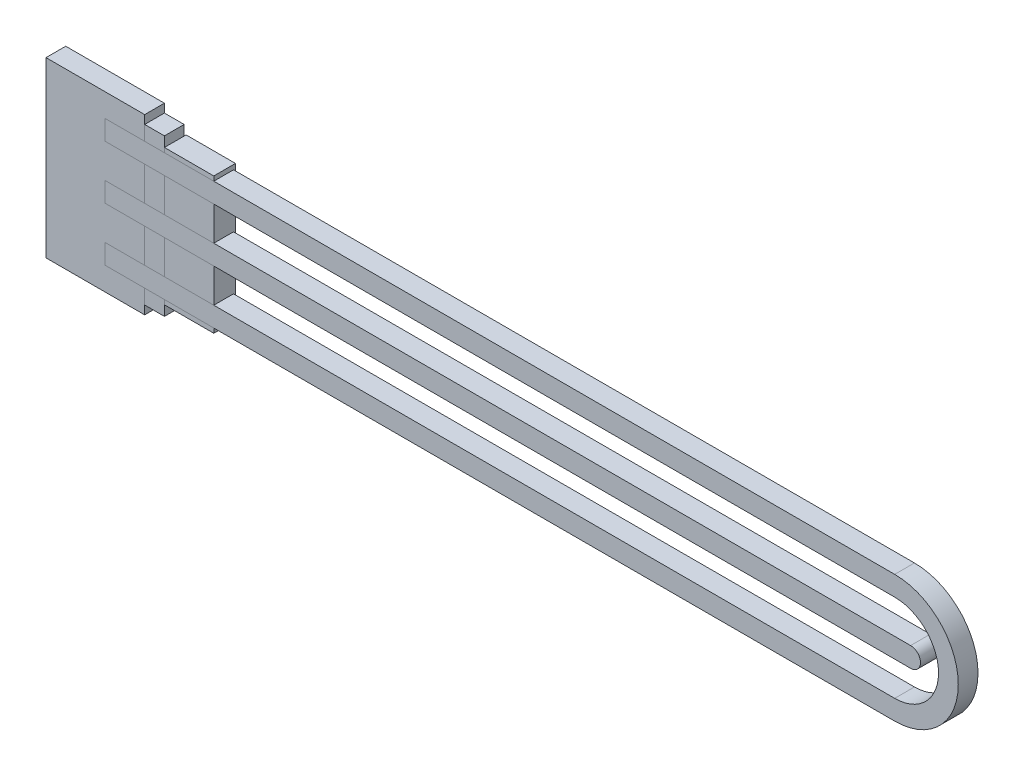
ISO-10303-21;
HEADER;
FILE_DESCRIPTION(('STEP AP214'),'2;1');
FILE_NAME('part.step','',(''),(''),'','','');
FILE_SCHEMA(('AUTOMOTIVE_DESIGN { 1 0 10303 214 1 1 1 1 }'));
ENDSEC;
DATA;
#1=APPLICATION_CONTEXT('core data for automotive mechanical design processes');
#2=APPLICATION_PROTOCOL_DEFINITION('international standard','automotive_design',2000,#1);
#3=PRODUCT_CONTEXT('',#1,'mechanical');
#4=PRODUCT('Part','Part','',(#3));
#5=PRODUCT_RELATED_PRODUCT_CATEGORY('part','',(#4));
#6=PRODUCT_DEFINITION_FORMATION('','',#4);
#7=PRODUCT_DEFINITION_CONTEXT('part definition',#1,'design');
#8=PRODUCT_DEFINITION('design','',#6,#7);
#9=PRODUCT_DEFINITION_SHAPE('','',#8);
#10=(LENGTH_UNIT() NAMED_UNIT(*) SI_UNIT(.MILLI.,.METRE.));
#11=(NAMED_UNIT(*) PLANE_ANGLE_UNIT() SI_UNIT($,.RADIAN.));
#12=(NAMED_UNIT(*) SI_UNIT($,.STERADIAN.) SOLID_ANGLE_UNIT());
#13=UNCERTAINTY_MEASURE_WITH_UNIT(LENGTH_MEASURE(1.E-05),#10,'distance_accuracy_value','');
#14=(GEOMETRIC_REPRESENTATION_CONTEXT(3) GLOBAL_UNCERTAINTY_ASSIGNED_CONTEXT((#13)) GLOBAL_UNIT_ASSIGNED_CONTEXT((#10,
#11,#12)) REPRESENTATION_CONTEXT('',''));
#15=CARTESIAN_POINT('',(0.,0.,0.));
#16=DIRECTION('',(0.,0.,1.));
#17=DIRECTION('',(1.,0.,0.));
#18=AXIS2_PLACEMENT_3D('',#15,#16,#17);
#19=CARTESIAN_POINT('',(0.,0.,0.));
#20=DIRECTION('',(0.,0.,-1.));
#21=DIRECTION('',(-1.,0.,0.));
#22=AXIS2_PLACEMENT_3D('',#19,#20,#21);
#23=PLANE('',#22);
#24=DIRECTION('',(0.,1.,0.));
#25=VECTOR('',#24,1.);
#26=CARTESIAN_POINT('',(20.,11.7376422554555,0.));
#27=LINE('',#26,#25);
#28=CARTESIAN_POINT('',(20.,-76.1473267015327,0.));
#29=VERTEX_POINT('',#28);
#30=CARTESIAN_POINT('',(20.,11.7376422554555,0.));
#31=VERTEX_POINT('',#30);
#32=EDGE_CURVE('E148',#29,#31,#27,.T.);
#33=ORIENTED_EDGE('',*,*,#32,.F.);
#34=DIRECTION('',(1.,0.,0.));
#35=VECTOR('',#34,1.);
#36=CARTESIAN_POINT('',(20.,-76.1473267015327,0.));
#37=LINE('',#36,#35);
#38=CARTESIAN_POINT('',(-30.,-76.1473267015327,0.));
#39=VERTEX_POINT('',#38);
#40=EDGE_CURVE('E159',#39,#29,#37,.T.);
#41=ORIENTED_EDGE('',*,*,#40,.F.);
#42=DIRECTION('',(0.,-1.,0.));
#43=VECTOR('',#42,1.);
#44=CARTESIAN_POINT('',(-30.,11.7376422554555,0.));
#45=LINE('',#44,#43);
#46=CARTESIAN_POINT('',(-30.,11.7376422554555,0.));
#47=VERTEX_POINT('',#46);
#48=EDGE_CURVE('E150',#47,#39,#45,.T.);
#49=ORIENTED_EDGE('',*,*,#48,.F.);
#50=DIRECTION('',(-1.,0.,0.));
#51=VECTOR('',#50,1.);
#52=CARTESIAN_POINT('',(20.,11.7376422554555,0.));
#53=LINE('',#52,#51);
#54=EDGE_CURVE('E140',#31,#47,#53,.T.);
#55=ORIENTED_EDGE('',*,*,#54,.F.);
#56=EDGE_LOOP('',(#33,#41,#49,#55));
#57=FACE_BOUND('',#56,.T.);
#58=ADVANCED_FACE('F98',(#57),#23,.T.);
#59=CARTESIAN_POINT('',(20.,-76.1473267015327,111.112648904926));
#60=DIRECTION('',(0.,1.,0.));
#61=DIRECTION('',(-1.,0.,0.));
#62=AXIS2_PLACEMENT_3D('',#59,#60,#61);
#63=PLANE('',#62);
#64=DIRECTION('',(0.,0.,-1.));
#65=VECTOR('',#64,1.);
#66=CARTESIAN_POINT('',(20.,-76.1473267015327,111.112648904926));
#67=LINE('',#66,#65);
#68=CARTESIAN_POINT('',(20.,-76.1473267015327,9.99999999999999));
#69=VERTEX_POINT('',#68);
#70=EDGE_CURVE('E153',#69,#29,#67,.T.);
#71=ORIENTED_EDGE('',*,*,#70,.F.);
#72=DIRECTION('',(-1.,0.,0.));
#73=VECTOR('',#72,1.);
#74=CARTESIAN_POINT('',(20.,-76.1473267015327,9.99999999999999));
#75=LINE('',#74,#73);
#76=CARTESIAN_POINT('',(-30.,-76.1473267015327,9.99999999999999));
#77=VERTEX_POINT('',#76);
#78=EDGE_CURVE('E102',#69,#77,#75,.T.);
#79=ORIENTED_EDGE('',*,*,#78,.T.);
#80=DIRECTION('',(0.,0.,-1.));
#81=VECTOR('',#80,1.);
#82=CARTESIAN_POINT('',(-30.,-76.1473267015327,111.112648904926));
#83=LINE('',#82,#81);
#84=EDGE_CURVE('E162',#77,#39,#83,.T.);
#85=ORIENTED_EDGE('',*,*,#84,.T.);
#86=ORIENTED_EDGE('',*,*,#40,.T.);
#87=EDGE_LOOP('',(#71,#79,#85,#86));
#88=FACE_BOUND('',#87,.T.);
#89=ADVANCED_FACE('F171',(#88),#63,.F.);
#90=CARTESIAN_POINT('',(-30.,11.7376422554555,111.112648904926));
#91=DIRECTION('',(1.,0.,0.));
#92=DIRECTION('',(0.,0.,-1.));
#93=AXIS2_PLACEMENT_3D('',#90,#91,#92);
#94=PLANE('',#93);
#95=ORIENTED_EDGE('',*,*,#84,.F.);
#96=DIRECTION('',(0.,1.,0.));
#97=VECTOR('',#96,1.);
#98=CARTESIAN_POINT('',(-30.,11.7376422554555,9.99999999999999));
#99=LINE('',#98,#97);
#100=CARTESIAN_POINT('',(-30.,11.7376422554555,9.99999999999999));
#101=VERTEX_POINT('',#100);
#102=EDGE_CURVE('E168',#77,#101,#99,.T.);
#103=ORIENTED_EDGE('',*,*,#102,.T.);
#104=DIRECTION('',(0.,0.,-1.));
#105=VECTOR('',#104,1.);
#106=CARTESIAN_POINT('',(-30.,11.7376422554555,111.112648904926));
#107=LINE('',#106,#105);
#108=EDGE_CURVE('E144',#101,#47,#107,.T.);
#109=ORIENTED_EDGE('',*,*,#108,.T.);
#110=ORIENTED_EDGE('',*,*,#48,.T.);
#111=EDGE_LOOP('',(#95,#103,#109,#110));
#112=FACE_BOUND('',#111,.T.);
#113=ADVANCED_FACE('F167',(#112),#94,.F.);
#114=CARTESIAN_POINT('',(20.,11.7376422554555,111.112648904926));
#115=DIRECTION('',(0.,-1.,0.));
#116=DIRECTION('',(1.,0.,0.));
#117=AXIS2_PLACEMENT_3D('',#114,#115,#116);
#118=PLANE('',#117);
#119=ORIENTED_EDGE('',*,*,#108,.F.);
#120=DIRECTION('',(1.,0.,0.));
#121=VECTOR('',#120,1.);
#122=CARTESIAN_POINT('',(20.,11.7376422554555,9.99999999999999));
#123=LINE('',#122,#121);
#124=CARTESIAN_POINT('',(20.,11.7376422554555,9.99999999999999));
#125=VERTEX_POINT('',#124);
#126=EDGE_CURVE('E107',#101,#125,#123,.T.);
#127=ORIENTED_EDGE('',*,*,#126,.T.);
#128=DIRECTION('',(0.,0.,-1.));
#129=VECTOR('',#128,1.);
#130=CARTESIAN_POINT('',(20.,11.7376422554555,111.112648904926));
#131=LINE('',#130,#129);
#132=EDGE_CURVE('E137',#125,#31,#131,.T.);
#133=ORIENTED_EDGE('',*,*,#132,.T.);
#134=ORIENTED_EDGE('',*,*,#54,.T.);
#135=EDGE_LOOP('',(#119,#127,#133,#134));
#136=FACE_BOUND('',#135,.T.);
#137=ADVANCED_FACE('F139',(#136),#118,.F.);
#138=CARTESIAN_POINT('',(20.,11.7376422554555,111.112648904926));
#139=DIRECTION('',(-1.,0.,0.));
#140=DIRECTION('',(0.,0.,1.));
#141=AXIS2_PLACEMENT_3D('',#138,#139,#140);
#142=PLANE('',#141);
#143=ORIENTED_EDGE('',*,*,#132,.F.);
#144=DIRECTION('',(0.,-1.,0.));
#145=VECTOR('',#144,1.);
#146=CARTESIAN_POINT('',(20.,11.7376422554555,9.99999999999999));
#147=LINE('',#146,#145);
#148=EDGE_CURVE('E13',#125,#69,#147,.T.);
#149=ORIENTED_EDGE('',*,*,#148,.T.);
#150=ORIENTED_EDGE('',*,*,#70,.T.);
#151=ORIENTED_EDGE('',*,*,#32,.T.);
#152=EDGE_LOOP('',(#143,#149,#150,#151));
#153=FACE_BOUND('',#152,.T.);
#154=ADVANCED_FACE('F100',(#153),#142,.F.);
#155=CARTESIAN_POINT('',(408.064158914082,-32.2048422230385,10.));
#156=DIRECTION('',(0.,0.,-1.));
#157=DIRECTION('',(-1.,0.,0.));
#158=AXIS2_PLACEMENT_3D('',#155,#156,#157);
#159=PLANE('',#158);
#160=ORIENTED_EDGE('',*,*,#126,.F.);
#161=ORIENTED_EDGE('',*,*,#102,.F.);
#162=ORIENTED_EDGE('',*,*,#78,.F.);
#163=ORIENTED_EDGE('',*,*,#148,.F.);
#164=EDGE_LOOP('',(#160,#161,#162,#163));
#165=FACE_BOUND('',#164,.T.);
#166=ADVANCED_FACE('F185',(#165),#159,.F.);
#167=CLOSED_SHELL('',(#58,#89,#113,#137,#154,#166));
#168=MANIFOLD_SOLID_BREP('B2',#167);
#169=CARTESIAN_POINT('',(0.,0.,0.));
#170=DIRECTION('',(0.,0.,1.));
#171=DIRECTION('',(1.,0.,0.));
#172=AXIS2_PLACEMENT_3D('',#169,#170,#171);
#173=PLANE('',#172);
#174=DIRECTION('',(0.,-1.,0.));
#175=VECTOR('',#174,1.);
#176=CARTESIAN_POINT('',(20.,0.,0.));
#177=LINE('',#176,#175);
#178=CARTESIAN_POINT('',(20.,7.40969782005409,0.));
#179=VERTEX_POINT('',#178);
#180=CARTESIAN_POINT('',(20.,-71.8193822661313,0.));
#181=VERTEX_POINT('',#180);
#182=EDGE_CURVE('E292',#179,#181,#177,.T.);
#183=ORIENTED_EDGE('',*,*,#182,.F.);
#184=DIRECTION('',(-1.,0.,0.));
#185=VECTOR('',#184,1.);
#186=CARTESIAN_POINT('',(0.,7.40969782005409,0.));
#187=LINE('',#186,#185);
#188=CARTESIAN_POINT('',(30.,7.40969782005409,0.));
#189=VERTEX_POINT('',#188);
#190=EDGE_CURVE('E302',#189,#179,#187,.T.);
#191=ORIENTED_EDGE('',*,*,#190,.F.);
#192=DIRECTION('',(0.,-1.,0.));
#193=VECTOR('',#192,1.);
#194=CARTESIAN_POINT('',(30.,0.,0.));
#195=LINE('',#194,#193);
#196=CARTESIAN_POINT('',(30.,-71.8193822661313,0.));
#197=VERTEX_POINT('',#196);
#198=EDGE_CURVE('E300',#189,#197,#195,.T.);
#199=ORIENTED_EDGE('',*,*,#198,.T.);
#200=DIRECTION('',(-1.,0.,0.));
#201=VECTOR('',#200,1.);
#202=CARTESIAN_POINT('',(0.,-71.8193822661313,0.));
#203=LINE('',#202,#201);
#204=EDGE_CURVE('E287',#197,#181,#203,.T.);
#205=ORIENTED_EDGE('',*,*,#204,.T.);
#206=EDGE_LOOP('',(#183,#191,#199,#205));
#207=FACE_BOUND('',#206,.T.);
#208=ADVANCED_FACE('F244',(#207),#173,.F.);
#209=CARTESIAN_POINT('',(0.,7.40969782005409,89.857667955577));
#210=DIRECTION('',(0.,-1.,0.));
#211=DIRECTION('',(0.,0.,-1.));
#212=AXIS2_PLACEMENT_3D('',#209,#210,#211);
#213=PLANE('',#212);
#214=DIRECTION('',(0.,0.,-1.));
#215=VECTOR('',#214,1.);
#216=CARTESIAN_POINT('',(20.,7.40969782005409,89.857667955577));
#217=LINE('',#216,#215);
#218=CARTESIAN_POINT('',(20.,7.40969782005409,9.99999999999999));
#219=VERTEX_POINT('',#218);
#220=EDGE_CURVE('E294',#219,#179,#217,.T.);
#221=ORIENTED_EDGE('',*,*,#220,.F.);
#222=DIRECTION('',(1.,0.,0.));
#223=VECTOR('',#222,1.);
#224=CARTESIAN_POINT('',(0.,7.40969782005409,9.99999999999999));
#225=LINE('',#224,#223);
#226=CARTESIAN_POINT('',(30.,7.40969782005409,9.99999999999999));
#227=VERTEX_POINT('',#226);
#228=EDGE_CURVE('E248',#219,#227,#225,.T.);
#229=ORIENTED_EDGE('',*,*,#228,.T.);
#230=DIRECTION('',(0.,0.,-1.));
#231=VECTOR('',#230,1.);
#232=CARTESIAN_POINT('',(30.,7.40969782005409,89.857667955577));
#233=LINE('',#232,#231);
#234=EDGE_CURVE('E307',#227,#189,#233,.T.);
#235=ORIENTED_EDGE('',*,*,#234,.T.);
#236=ORIENTED_EDGE('',*,*,#190,.T.);
#237=EDGE_LOOP('',(#221,#229,#235,#236));
#238=FACE_BOUND('',#237,.T.);
#239=ADVANCED_FACE('F317',(#238),#213,.F.);
#240=CARTESIAN_POINT('',(30.,0.,89.857667955577));
#241=DIRECTION('',(1.,0.,0.));
#242=DIRECTION('',(0.,0.,-1.));
#243=AXIS2_PLACEMENT_3D('',#240,#241,#242);
#244=PLANE('',#243);
#245=DIRECTION('',(0.,1.,0.));
#246=VECTOR('',#245,1.);
#247=CARTESIAN_POINT('',(30.,0.,9.99999999999999));
#248=LINE('',#247,#246);
#249=CARTESIAN_POINT('',(30.,-71.8193822661313,9.99999999999999));
#250=VERTEX_POINT('',#249);
#251=EDGE_CURVE('E313',#250,#227,#248,.T.);
#252=ORIENTED_EDGE('',*,*,#251,.F.);
#253=DIRECTION('',(0.,0.,-1.));
#254=VECTOR('',#253,1.);
#255=CARTESIAN_POINT('',(30.,-71.8193822661313,89.857667955577));
#256=LINE('',#255,#254);
#257=EDGE_CURVE('E290',#250,#197,#256,.T.);
#258=ORIENTED_EDGE('',*,*,#257,.T.);
#259=ORIENTED_EDGE('',*,*,#198,.F.);
#260=ORIENTED_EDGE('',*,*,#234,.F.);
#261=EDGE_LOOP('',(#252,#258,#259,#260));
#262=FACE_BOUND('',#261,.T.);
#263=ADVANCED_FACE('F311',(#262),#244,.T.);
#264=CARTESIAN_POINT('',(0.,-71.8193822661313,89.857667955577));
#265=DIRECTION('',(0.,-1.,0.));
#266=DIRECTION('',(0.,0.,-1.));
#267=AXIS2_PLACEMENT_3D('',#264,#265,#266);
#268=PLANE('',#267);
#269=DIRECTION('',(1.,0.,0.));
#270=VECTOR('',#269,1.);
#271=CARTESIAN_POINT('',(0.,-71.8193822661313,9.99999999999999));
#272=LINE('',#271,#270);
#273=CARTESIAN_POINT('',(20.,-71.8193822661313,9.99999999999999));
#274=VERTEX_POINT('',#273);
#275=EDGE_CURVE('E253',#274,#250,#272,.T.);
#276=ORIENTED_EDGE('',*,*,#275,.F.);
#277=DIRECTION('',(0.,0.,-1.));
#278=VECTOR('',#277,1.);
#279=CARTESIAN_POINT('',(20.,-71.8193822661313,89.857667955577));
#280=LINE('',#279,#278);
#281=EDGE_CURVE('E283',#274,#181,#280,.T.);
#282=ORIENTED_EDGE('',*,*,#281,.T.);
#283=ORIENTED_EDGE('',*,*,#204,.F.);
#284=ORIENTED_EDGE('',*,*,#257,.F.);
#285=EDGE_LOOP('',(#276,#282,#283,#284));
#286=FACE_BOUND('',#285,.T.);
#287=ADVANCED_FACE('F285',(#286),#268,.T.);
#288=CARTESIAN_POINT('',(20.,0.,89.857667955577));
#289=DIRECTION('',(1.,0.,0.));
#290=DIRECTION('',(0.,0.,-1.));
#291=AXIS2_PLACEMENT_3D('',#288,#289,#290);
#292=PLANE('',#291);
#293=ORIENTED_EDGE('',*,*,#281,.F.);
#294=DIRECTION('',(0.,1.,0.));
#295=VECTOR('',#294,1.);
#296=CARTESIAN_POINT('',(20.,0.,9.99999999999999));
#297=LINE('',#296,#295);
#298=EDGE_CURVE('E96',#274,#219,#297,.T.);
#299=ORIENTED_EDGE('',*,*,#298,.T.);
#300=ORIENTED_EDGE('',*,*,#220,.T.);
#301=ORIENTED_EDGE('',*,*,#182,.T.);
#302=EDGE_LOOP('',(#293,#299,#300,#301));
#303=FACE_BOUND('',#302,.T.);
#304=ADVANCED_FACE('F246',(#303),#292,.F.);
#305=CARTESIAN_POINT('',(408.064158914082,-32.2048422230385,10.));
#306=DIRECTION('',(0.,0.,-1.));
#307=DIRECTION('',(-1.,0.,0.));
#308=AXIS2_PLACEMENT_3D('',#305,#306,#307);
#309=PLANE('',#308);
#310=ORIENTED_EDGE('',*,*,#275,.T.);
#311=ORIENTED_EDGE('',*,*,#251,.T.);
#312=ORIENTED_EDGE('',*,*,#228,.F.);
#313=ORIENTED_EDGE('',*,*,#298,.F.);
#314=EDGE_LOOP('',(#310,#311,#312,#313));
#315=FACE_BOUND('',#314,.T.);
#316=ADVANCED_FACE('F331',(#315),#309,.F.);
#317=CLOSED_SHELL('',(#208,#239,#263,#287,#304,#316));
#318=MANIFOLD_SOLID_BREP('B7',#317);
#319=CARTESIAN_POINT('',(30.,0.,-0.999999999999957));
#320=DIRECTION('',(-1.,0.,0.));
#321=DIRECTION('',(0.,0.,1.));
#322=AXIS2_PLACEMENT_3D('',#319,#320,#321);
#323=PLANE('',#322);
#324=DIRECTION('',(0.,0.,1.));
#325=VECTOR('',#324,1.);
#326=CARTESIAN_POINT('',(30.,-66.7222777292492,-0.999999999999957));
#327=LINE('',#326,#325);
#328=CARTESIAN_POINT('',(30.,-66.7222777292492,-0.999999999999957));
#329=VERTEX_POINT('',#328);
#330=CARTESIAN_POINT('',(30.,-66.7222777292492,9.99999999999999));
#331=VERTEX_POINT('',#330);
#332=EDGE_CURVE('E394',#329,#331,#327,.T.);
#333=ORIENTED_EDGE('',*,*,#332,.T.);
#334=DIRECTION('',(0.,1.,0.));
#335=VECTOR('',#334,1.);
#336=CARTESIAN_POINT('',(30.,0.,9.99999999999999));
#337=LINE('',#336,#335);
#338=CARTESIAN_POINT('',(30.,2.31259328317195,9.99999999999999));
#339=VERTEX_POINT('',#338);
#340=EDGE_CURVE('E452',#331,#339,#337,.T.);
#341=ORIENTED_EDGE('',*,*,#340,.T.);
#342=DIRECTION('',(0.,0.,1.));
#343=VECTOR('',#342,1.);
#344=CARTESIAN_POINT('',(30.,2.31259328317195,-0.999999999999957));
#345=LINE('',#344,#343);
#346=CARTESIAN_POINT('',(30.,2.31259328317195,-0.999999999999957));
#347=VERTEX_POINT('',#346);
#348=EDGE_CURVE('E242',#347,#339,#345,.T.);
#349=ORIENTED_EDGE('',*,*,#348,.F.);
#350=DIRECTION('',(0.,-1.,0.));
#351=VECTOR('',#350,1.);
#352=CARTESIAN_POINT('',(30.,0.,-0.999999999999957));
#353=LINE('',#352,#351);
#354=EDGE_CURVE('E451',#347,#329,#353,.T.);
#355=ORIENTED_EDGE('',*,*,#354,.T.);
#356=EDGE_LOOP('',(#333,#341,#349,#355));
#357=FACE_BOUND('',#356,.T.);
#358=ADVANCED_FACE('F391',(#357),#323,.T.);
#359=CARTESIAN_POINT('',(0.,2.31259328317195,-0.999999999999957));
#360=DIRECTION('',(0.,-1.,0.));
#361=DIRECTION('',(1.,0.,0.));
#362=AXIS2_PLACEMENT_3D('',#359,#360,#361);
#363=PLANE('',#362);
#364=ORIENTED_EDGE('',*,*,#348,.T.);
#365=DIRECTION('',(-1.,0.,0.));
#366=VECTOR('',#365,1.);
#367=CARTESIAN_POINT('',(0.,2.31259328317195,9.99999999999999));
#368=LINE('',#367,#366);
#369=CARTESIAN_POINT('',(55.,2.31259328317195,9.99999999999999));
#370=VERTEX_POINT('',#369);
#371=EDGE_CURVE('E446',#370,#339,#368,.T.);
#372=ORIENTED_EDGE('',*,*,#371,.F.);
#373=DIRECTION('',(0.,0.,1.));
#374=VECTOR('',#373,1.);
#375=CARTESIAN_POINT('',(55.,2.31259328317195,-0.999999999999957));
#376=LINE('',#375,#374);
#377=CARTESIAN_POINT('',(55.,2.31259328317195,-0.999999999999957));
#378=VERTEX_POINT('',#377);
#379=EDGE_CURVE('E399',#378,#370,#376,.T.);
#380=ORIENTED_EDGE('',*,*,#379,.F.);
#381=DIRECTION('',(1.,0.,0.));
#382=VECTOR('',#381,1.);
#383=CARTESIAN_POINT('',(0.,2.31259328317195,-0.999999999999957));
#384=LINE('',#383,#382);
#385=EDGE_CURVE('E412',#347,#378,#384,.T.);
#386=ORIENTED_EDGE('',*,*,#385,.F.);
#387=EDGE_LOOP('',(#364,#372,#380,#386));
#388=FACE_BOUND('',#387,.T.);
#389=ADVANCED_FACE('F450',(#388),#363,.F.);
#390=CARTESIAN_POINT('',(55.,0.,-0.999999999999957));
#391=DIRECTION('',(-1.,0.,0.));
#392=DIRECTION('',(0.,0.,1.));
#393=AXIS2_PLACEMENT_3D('',#390,#391,#392);
#394=PLANE('',#393);
#395=ORIENTED_EDGE('',*,*,#379,.T.);
#396=DIRECTION('',(0.,1.,0.));
#397=VECTOR('',#396,1.);
#398=CARTESIAN_POINT('',(55.,0.,9.99999999999999));
#399=LINE('',#398,#397);
#400=CARTESIAN_POINT('',(55.,-66.7222777292492,9.99999999999999));
#401=VERTEX_POINT('',#400);
#402=EDGE_CURVE('E435',#401,#370,#399,.T.);
#403=ORIENTED_EDGE('',*,*,#402,.F.);
#404=DIRECTION('',(0.,0.,1.));
#405=VECTOR('',#404,1.);
#406=CARTESIAN_POINT('',(55.,-66.7222777292492,-0.999999999999957));
#407=LINE('',#406,#405);
#408=CARTESIAN_POINT('',(55.,-66.7222777292492,-0.999999999999957));
#409=VERTEX_POINT('',#408);
#410=EDGE_CURVE('E439',#409,#401,#407,.T.);
#411=ORIENTED_EDGE('',*,*,#410,.F.);
#412=DIRECTION('',(0.,-1.,0.));
#413=VECTOR('',#412,1.);
#414=CARTESIAN_POINT('',(55.,0.,-0.999999999999957));
#415=LINE('',#414,#413);
#416=EDGE_CURVE('E436',#378,#409,#415,.T.);
#417=ORIENTED_EDGE('',*,*,#416,.F.);
#418=EDGE_LOOP('',(#395,#403,#411,#417));
#419=FACE_BOUND('',#418,.T.);
#420=ADVANCED_FACE('F433',(#419),#394,.F.);
#421=CARTESIAN_POINT('',(0.,-66.7222777292492,-0.999999999999957));
#422=DIRECTION('',(0.,-1.,0.));
#423=DIRECTION('',(1.,0.,0.));
#424=AXIS2_PLACEMENT_3D('',#421,#422,#423);
#425=PLANE('',#424);
#426=ORIENTED_EDGE('',*,*,#410,.T.);
#427=DIRECTION('',(-1.,0.,0.));
#428=VECTOR('',#427,1.);
#429=CARTESIAN_POINT('',(0.,-66.7222777292492,9.99999999999999));
#430=LINE('',#429,#428);
#431=EDGE_CURVE('E448',#401,#331,#430,.T.);
#432=ORIENTED_EDGE('',*,*,#431,.T.);
#433=ORIENTED_EDGE('',*,*,#332,.F.);
#434=DIRECTION('',(1.,0.,0.));
#435=VECTOR('',#434,1.);
#436=CARTESIAN_POINT('',(0.,-66.7222777292492,-0.999999999999957));
#437=LINE('',#436,#435);
#438=EDGE_CURVE('E454',#329,#409,#437,.T.);
#439=ORIENTED_EDGE('',*,*,#438,.T.);
#440=EDGE_LOOP('',(#426,#432,#433,#439));
#441=FACE_BOUND('',#440,.T.);
#442=ADVANCED_FACE('F464',(#441),#425,.T.);
#443=CARTESIAN_POINT('',(0.,0.,-0.999999999999957));
#444=DIRECTION('',(0.,0.,1.));
#445=DIRECTION('',(1.,0.,0.));
#446=AXIS2_PLACEMENT_3D('',#443,#444,#445);
#447=PLANE('',#446);
#448=ORIENTED_EDGE('',*,*,#354,.F.);
#449=ORIENTED_EDGE('',*,*,#385,.T.);
#450=ORIENTED_EDGE('',*,*,#416,.T.);
#451=ORIENTED_EDGE('',*,*,#438,.F.);
#452=EDGE_LOOP('',(#448,#449,#450,#451));
#453=FACE_BOUND('',#452,.T.);
#454=ADVANCED_FACE('F466',(#453),#447,.F.);
#455=CARTESIAN_POINT('',(408.064158914082,-32.2048422230385,10.));
#456=DIRECTION('',(0.,0.,-1.));
#457=DIRECTION('',(-1.,0.,0.));
#458=AXIS2_PLACEMENT_3D('',#455,#456,#457);
#459=PLANE('',#458);
#460=ORIENTED_EDGE('',*,*,#431,.F.);
#461=ORIENTED_EDGE('',*,*,#402,.T.);
#462=ORIENTED_EDGE('',*,*,#371,.T.);
#463=ORIENTED_EDGE('',*,*,#340,.F.);
#464=EDGE_LOOP('',(#460,#461,#462,#463));
#465=FACE_BOUND('',#464,.T.);
#466=ADVANCED_FACE('F444',(#465),#459,.F.);
#467=CLOSED_SHELL('',(#358,#389,#420,#442,#454,#466));
#468=MANIFOLD_SOLID_BREP('B90',#467);
#469=CARTESIAN_POINT('',(-15.,-59.4096844460773,5.));
#470=DIRECTION('',(1.,0.,0.));
#471=DIRECTION('',(0.,0.,-1.));
#472=AXIS2_PLACEMENT_3D('',#469,#470,#471);
#473=CYLINDRICAL_SURFACE('',#472,3.);
#474=CARTESIAN_POINT('',(-15.,-59.4096844460773,5.));
#475=DIRECTION('',(-1.,0.,0.));
#476=DIRECTION('',(0.,0.,1.));
#477=AXIS2_PLACEMENT_3D('',#474,#475,#476);
#478=CIRCLE('',#477,3.);
#479=CARTESIAN_POINT('',(-15.,-59.4096844460773,8.));
#480=VERTEX_POINT('',#479);
#481=EDGE_CURVE('E390',#480,#480,#478,.T.);
#482=ORIENTED_EDGE('',*,*,#481,.F.);
#483=EDGE_LOOP('',(#482));
#484=FACE_BOUND('',#483,.T.);
#485=CARTESIAN_POINT('',(0.,-59.4096844460773,5.));
#486=DIRECTION('',(-1.,0.,0.));
#487=DIRECTION('',(0.,0.,1.));
#488=AXIS2_PLACEMENT_3D('',#485,#486,#487);
#489=CIRCLE('',#488,3.);
#490=CARTESIAN_POINT('',(0.,-59.4096844460773,8.));
#491=VERTEX_POINT('',#490);
#492=EDGE_CURVE('E547',#491,#491,#489,.T.);
#493=ORIENTED_EDGE('',*,*,#492,.T.);
#494=EDGE_LOOP('',(#493));
#495=FACE_BOUND('',#494,.T.);
#496=ADVANCED_FACE('F544',(#484,#495),#473,.T.);
#497=CARTESIAN_POINT('',(-15.,-59.4096844460773,5.));
#498=DIRECTION('',(-1.,0.,0.));
#499=DIRECTION('',(0.,0.,1.));
#500=AXIS2_PLACEMENT_3D('',#497,#498,#499);
#501=PLANE('',#500);
#502=ORIENTED_EDGE('',*,*,#481,.T.);
#503=EDGE_LOOP('',(#502));
#504=FACE_BOUND('',#503,.T.);
#505=ADVANCED_FACE('F559',(#504),#501,.T.);
#506=CARTESIAN_POINT('',(0.,-59.4096844460773,5.));
#507=DIRECTION('',(-1.,0.,0.));
#508=DIRECTION('',(0.,0.,1.));
#509=AXIS2_PLACEMENT_3D('',#506,#507,#508);
#510=PLANE('',#509);
#511=ORIENTED_EDGE('',*,*,#492,.F.);
#512=EDGE_LOOP('',(#511));
#513=FACE_BOUND('',#512,.T.);
#514=ADVANCED_FACE('F557',(#513),#510,.F.);
#515=CLOSED_SHELL('',(#496,#505,#514));
#516=MANIFOLD_SOLID_BREP('B236',#515);
#517=CARTESIAN_POINT('',(-15.,-4.90697990871341,5.));
#518=DIRECTION('',(1.,0.,0.));
#519=DIRECTION('',(0.,0.,-1.));
#520=AXIS2_PLACEMENT_3D('',#517,#518,#519);
#521=CYLINDRICAL_SURFACE('',#520,3.);
#522=CARTESIAN_POINT('',(-15.,-4.90697990871341,5.));
#523=DIRECTION('',(-1.,0.,0.));
#524=DIRECTION('',(0.,0.,1.));
#525=AXIS2_PLACEMENT_3D('',#522,#523,#524);
#526=CIRCLE('',#525,3.);
#527=CARTESIAN_POINT('',(-15.,-4.90697990871341,8.));
#528=VERTEX_POINT('',#527);
#529=EDGE_CURVE('E543',#528,#528,#526,.T.);
#530=ORIENTED_EDGE('',*,*,#529,.F.);
#531=EDGE_LOOP('',(#530));
#532=FACE_BOUND('',#531,.T.);
#533=CARTESIAN_POINT('',(0.,-4.90697990871341,5.));
#534=DIRECTION('',(-1.,0.,0.));
#535=DIRECTION('',(0.,0.,1.));
#536=AXIS2_PLACEMENT_3D('',#533,#534,#535);
#537=CIRCLE('',#536,3.);
#538=CARTESIAN_POINT('',(0.,-4.90697990871341,8.));
#539=VERTEX_POINT('',#538);
#540=EDGE_CURVE('E604',#539,#539,#537,.T.);
#541=ORIENTED_EDGE('',*,*,#540,.T.);
#542=EDGE_LOOP('',(#541));
#543=FACE_BOUND('',#542,.T.);
#544=ADVANCED_FACE('F601',(#532,#543),#521,.T.);
#545=CARTESIAN_POINT('',(-15.,-4.90697990871341,5.));
#546=DIRECTION('',(-1.,0.,0.));
#547=DIRECTION('',(0.,0.,1.));
#548=AXIS2_PLACEMENT_3D('',#545,#546,#547);
#549=PLANE('',#548);
#550=ORIENTED_EDGE('',*,*,#529,.T.);
#551=EDGE_LOOP('',(#550));
#552=FACE_BOUND('',#551,.T.);
#553=ADVANCED_FACE('F616',(#552),#549,.T.);
#554=CARTESIAN_POINT('',(0.,-4.90697990871341,5.));
#555=DIRECTION('',(-1.,0.,0.));
#556=DIRECTION('',(0.,0.,1.));
#557=AXIS2_PLACEMENT_3D('',#554,#555,#556);
#558=PLANE('',#557);
#559=ORIENTED_EDGE('',*,*,#540,.F.);
#560=EDGE_LOOP('',(#559));
#561=FACE_BOUND('',#560,.T.);
#562=ADVANCED_FACE('F614',(#561),#558,.F.);
#563=CLOSED_SHELL('',(#544,#553,#562));
#564=MANIFOLD_SOLID_BREP('B385',#563);
#565=CARTESIAN_POINT('',(0.,-27.2048422230386,10.));
#566=DIRECTION('',(1.,0.,0.));
#567=DIRECTION('',(0.,1.,0.));
#568=AXIS2_PLACEMENT_3D('',#565,#566,#567);
#569=PLANE('',#568);
#570=DIRECTION('',(0.,-1.,0.));
#571=VECTOR('',#570,1.);
#572=CARTESIAN_POINT('',(0.,-27.2048422230386,0.));
#573=LINE('',#572,#571);
#574=CARTESIAN_POINT('',(0.,-27.2048422230386,0.));
#575=VERTEX_POINT('',#574);
#576=CARTESIAN_POINT('',(0.,-37.2048422230386,0.));
#577=VERTEX_POINT('',#576);
#578=EDGE_CURVE('E599',#575,#577,#573,.T.);
#579=ORIENTED_EDGE('',*,*,#578,.T.);
#580=DIRECTION('',(0.,0.,-1.));
#581=VECTOR('',#580,1.);
#582=CARTESIAN_POINT('',(0.,-37.2048422230386,10.));
#583=LINE('',#582,#581);
#584=CARTESIAN_POINT('',(0.,-37.2048422230386,10.));
#585=VERTEX_POINT('',#584);
#586=EDGE_CURVE('E728',#585,#577,#583,.T.);
#587=ORIENTED_EDGE('',*,*,#586,.F.);
#588=DIRECTION('',(0.,-1.,0.));
#589=VECTOR('',#588,1.);
#590=CARTESIAN_POINT('',(0.,-27.2048422230386,10.));
#591=LINE('',#590,#589);
#592=CARTESIAN_POINT('',(0.,-27.2048422230386,10.));
#593=VERTEX_POINT('',#592);
#594=EDGE_CURVE('E661',#593,#585,#591,.T.);
#595=ORIENTED_EDGE('',*,*,#594,.F.);
#596=DIRECTION('',(0.,0.,-1.));
#597=VECTOR('',#596,1.);
#598=CARTESIAN_POINT('',(0.,-27.2048422230386,10.));
#599=LINE('',#598,#597);
#600=EDGE_CURVE('E716',#593,#575,#599,.T.);
#601=ORIENTED_EDGE('',*,*,#600,.T.);
#602=EDGE_LOOP('',(#579,#587,#595,#601));
#603=FACE_BOUND('',#602,.T.);
#604=ADVANCED_FACE('F657',(#603),#569,.F.);
#605=CARTESIAN_POINT('',(0.,-37.2048422230386,10.));
#606=DIRECTION('',(0.,1.,0.));
#607=DIRECTION('',(-1.,0.,0.));
#608=AXIS2_PLACEMENT_3D('',#605,#606,#607);
#609=PLANE('',#608);
#610=DIRECTION('',(1.,0.,0.));
#611=VECTOR('',#610,1.);
#612=CARTESIAN_POINT('',(0.,-37.2048422230386,0.));
#613=LINE('',#612,#611);
#614=CARTESIAN_POINT('',(408.064158914082,-37.2048422230385,0.));
#615=VERTEX_POINT('',#614);
#616=EDGE_CURVE('E667',#577,#615,#613,.T.);
#617=ORIENTED_EDGE('',*,*,#616,.T.);
#618=DIRECTION('',(0.,0.,-1.));
#619=VECTOR('',#618,1.);
#620=CARTESIAN_POINT('',(408.064158914082,-37.2048422230385,10.));
#621=LINE('',#620,#619);
#622=CARTESIAN_POINT('',(408.064158914082,-37.2048422230385,10.));
#623=VERTEX_POINT('',#622);
#624=EDGE_CURVE('E712',#623,#615,#621,.T.);
#625=ORIENTED_EDGE('',*,*,#624,.F.);
#626=DIRECTION('',(1.,0.,0.));
#627=VECTOR('',#626,1.);
#628=CARTESIAN_POINT('',(0.,-37.2048422230386,10.));
#629=LINE('',#628,#627);
#630=EDGE_CURVE('E691',#585,#623,#629,.T.);
#631=ORIENTED_EDGE('',*,*,#630,.F.);
#632=ORIENTED_EDGE('',*,*,#586,.T.);
#633=EDGE_LOOP('',(#617,#625,#631,#632));
#634=FACE_BOUND('',#633,.T.);
#635=ADVANCED_FACE('F731',(#634),#609,.F.);
#636=CARTESIAN_POINT('',(408.064158914082,-32.2048422230385,10.));
#637=DIRECTION('',(0.,0.,-1.));
#638=DIRECTION('',(-1.,0.,0.));
#639=AXIS2_PLACEMENT_3D('',#636,#637,#638);
#640=CYLINDRICAL_SURFACE('',#639,5.);
#641=CARTESIAN_POINT('',(408.064158914082,-32.2048422230385,0.));
#642=DIRECTION('',(0.,0.,1.));
#643=DIRECTION('',(-1.,0.,0.));
#644=AXIS2_PLACEMENT_3D('',#641,#642,#643);
#645=CIRCLE('',#644,5.);
#646=CARTESIAN_POINT('',(408.064158914082,-27.2048422230385,0.));
#647=VERTEX_POINT('',#646);
#648=EDGE_CURVE('E707',#615,#647,#645,.T.);
#649=ORIENTED_EDGE('',*,*,#648,.T.);
#650=DIRECTION('',(0.,0.,-1.));
#651=VECTOR('',#650,1.);
#652=CARTESIAN_POINT('',(408.064158914082,-27.2048422230385,10.));
#653=LINE('',#652,#651);
#654=CARTESIAN_POINT('',(408.064158914082,-27.2048422230385,10.));
#655=VERTEX_POINT('',#654);
#656=EDGE_CURVE('E710',#655,#647,#653,.T.);
#657=ORIENTED_EDGE('',*,*,#656,.F.);
#658=CARTESIAN_POINT('',(408.064158914082,-32.2048422230385,10.));
#659=DIRECTION('',(0.,0.,1.));
#660=DIRECTION('',(-1.,0.,0.));
#661=AXIS2_PLACEMENT_3D('',#658,#659,#660);
#662=CIRCLE('',#661,5.);
#663=EDGE_CURVE('E724',#623,#655,#662,.T.);
#664=ORIENTED_EDGE('',*,*,#663,.F.);
#665=ORIENTED_EDGE('',*,*,#624,.T.);
#666=EDGE_LOOP('',(#649,#657,#664,#665));
#667=FACE_BOUND('',#666,.T.);
#668=ADVANCED_FACE('F708',(#667),#640,.T.);
#669=CARTESIAN_POINT('',(0.,-27.2048422230386,10.));
#670=DIRECTION('',(0.,-1.,0.));
#671=DIRECTION('',(1.,0.,0.));
#672=AXIS2_PLACEMENT_3D('',#669,#670,#671);
#673=PLANE('',#672);
#674=DIRECTION('',(-1.,0.,0.));
#675=VECTOR('',#674,1.);
#676=CARTESIAN_POINT('',(0.,-27.2048422230386,0.));
#677=LINE('',#676,#675);
#678=EDGE_CURVE('E701',#647,#575,#677,.T.);
#679=ORIENTED_EDGE('',*,*,#678,.T.);
#680=ORIENTED_EDGE('',*,*,#600,.F.);
#681=DIRECTION('',(-1.,0.,0.));
#682=VECTOR('',#681,1.);
#683=CARTESIAN_POINT('',(0.,-27.2048422230386,10.));
#684=LINE('',#683,#682);
#685=EDGE_CURVE('E715',#655,#593,#684,.T.);
#686=ORIENTED_EDGE('',*,*,#685,.F.);
#687=ORIENTED_EDGE('',*,*,#656,.T.);
#688=EDGE_LOOP('',(#679,#680,#686,#687));
#689=FACE_BOUND('',#688,.T.);
#690=ADVANCED_FACE('F714',(#689),#673,.F.);
#691=CARTESIAN_POINT('',(408.064158914082,-32.2048422230385,10.));
#692=DIRECTION('',(0.,0.,-1.));
#693=DIRECTION('',(-1.,0.,0.));
#694=AXIS2_PLACEMENT_3D('',#691,#692,#693);
#695=PLANE('',#694);
#696=ORIENTED_EDGE('',*,*,#594,.T.);
#697=ORIENTED_EDGE('',*,*,#630,.T.);
#698=ORIENTED_EDGE('',*,*,#663,.T.);
#699=ORIENTED_EDGE('',*,*,#685,.T.);
#700=EDGE_LOOP('',(#696,#697,#698,#699));
#701=FACE_BOUND('',#700,.T.);
#702=ADVANCED_FACE('F659',(#701),#695,.F.);
#703=CARTESIAN_POINT('',(408.064158914082,-32.2048422230385,0.));
#704=DIRECTION('',(0.,0.,-1.));
#705=DIRECTION('',(-1.,0.,0.));
#706=AXIS2_PLACEMENT_3D('',#703,#704,#705);
#707=PLANE('',#706);
#708=ORIENTED_EDGE('',*,*,#578,.F.);
#709=ORIENTED_EDGE('',*,*,#678,.F.);
#710=ORIENTED_EDGE('',*,*,#648,.F.);
#711=ORIENTED_EDGE('',*,*,#616,.F.);
#712=EDGE_LOOP('',(#708,#709,#710,#711));
#713=FACE_BOUND('',#712,.T.);
#714=ADVANCED_FACE('F718',(#713),#707,.T.);
#715=CLOSED_SHELL('',(#604,#635,#668,#690,#702,#714));
#716=MANIFOLD_SOLID_BREP('B538',#715);
#717=CARTESIAN_POINT('',(0.,-10.,10.));
#718=DIRECTION('',(1.,0.,0.));
#719=DIRECTION('',(0.,0.,-1.));
#720=AXIS2_PLACEMENT_3D('',#717,#718,#719);
#721=PLANE('',#720);
#722=DIRECTION('',(0.,-1.,0.));
#723=VECTOR('',#722,1.);
#724=CARTESIAN_POINT('',(0.,-10.,0.));
#725=LINE('',#724,#723);
#726=CARTESIAN_POINT('',(0.,0.,0.));
#727=VERTEX_POINT('',#726);
#728=CARTESIAN_POINT('',(0.,-10.,0.));
#729=VERTEX_POINT('',#728);
#730=EDGE_CURVE('E889',#727,#729,#725,.T.);
#731=ORIENTED_EDGE('',*,*,#730,.T.);
#732=DIRECTION('',(0.,0.,-1.));
#733=VECTOR('',#732,1.);
#734=CARTESIAN_POINT('',(0.,-10.,10.));
#735=LINE('',#734,#733);
#736=CARTESIAN_POINT('',(0.,-10.,10.));
#737=VERTEX_POINT('',#736);
#738=EDGE_CURVE('E655',#737,#729,#735,.T.);
#739=ORIENTED_EDGE('',*,*,#738,.F.);
#740=DIRECTION('',(0.,-1.,0.));
#741=VECTOR('',#740,1.);
#742=CARTESIAN_POINT('',(0.,-10.,10.));
#743=LINE('',#742,#741);
#744=CARTESIAN_POINT('',(0.,0.,10.));
#745=VERTEX_POINT('',#744);
#746=EDGE_CURVE('E903',#745,#737,#743,.T.);
#747=ORIENTED_EDGE('',*,*,#746,.F.);
#748=DIRECTION('',(0.,0.,-1.));
#749=VECTOR('',#748,1.);
#750=CARTESIAN_POINT('',(0.,0.,10.));
#751=LINE('',#750,#749);
#752=EDGE_CURVE('E885',#745,#727,#751,.T.);
#753=ORIENTED_EDGE('',*,*,#752,.T.);
#754=EDGE_LOOP('',(#731,#739,#747,#753));
#755=FACE_BOUND('',#754,.T.);
#756=ADVANCED_FACE('F793',(#755),#721,.F.);
#757=CARTESIAN_POINT('',(0.,-10.,10.));
#758=DIRECTION('',(0.,1.,0.));
#759=DIRECTION('',(0.,0.,1.));
#760=AXIS2_PLACEMENT_3D('',#757,#758,#759);
#761=PLANE('',#760);
#762=DIRECTION('',(1.,0.,0.));
#763=VECTOR('',#762,1.);
#764=CARTESIAN_POINT('',(0.,-10.,0.));
#765=LINE('',#764,#763);
#766=CARTESIAN_POINT('',(400.,-9.99999999999996,0.));
#767=VERTEX_POINT('',#766);
#768=EDGE_CURVE('E892',#729,#767,#765,.T.);
#769=ORIENTED_EDGE('',*,*,#768,.T.);
#770=DIRECTION('',(0.,0.,-1.));
#771=VECTOR('',#770,1.);
#772=CARTESIAN_POINT('',(400.,-9.99999999999996,10.));
#773=LINE('',#772,#771);
#774=CARTESIAN_POINT('',(400.,-9.99999999999996,10.));
#775=VERTEX_POINT('',#774);
#776=EDGE_CURVE('E801',#775,#767,#773,.T.);
#777=ORIENTED_EDGE('',*,*,#776,.F.);
#778=DIRECTION('',(1.,0.,0.));
#779=VECTOR('',#778,1.);
#780=CARTESIAN_POINT('',(0.,-10.,10.));
#781=LINE('',#780,#779);
#782=EDGE_CURVE('E852',#737,#775,#781,.T.);
#783=ORIENTED_EDGE('',*,*,#782,.F.);
#784=ORIENTED_EDGE('',*,*,#738,.T.);
#785=EDGE_LOOP('',(#769,#777,#783,#784));
#786=FACE_BOUND('',#785,.T.);
#787=ADVANCED_FACE('F938',(#786),#761,.F.);
#788=CARTESIAN_POINT('',(400.,-32.2048422230385,10.));
#789=DIRECTION('',(0.,0.,-1.));
#790=DIRECTION('',(-1.,0.,0.));
#791=AXIS2_PLACEMENT_3D('',#788,#789,#790);
#792=CYLINDRICAL_SURFACE('',#791,22.2048422230386);
#793=CARTESIAN_POINT('',(400.,-32.2048422230385,0.));
#794=DIRECTION('',(0.,0.,-1.));
#795=DIRECTION('',(-1.,0.,0.));
#796=AXIS2_PLACEMENT_3D('',#793,#794,#795);
#797=CIRCLE('',#796,22.2048422230386);
#798=CARTESIAN_POINT('',(400.,-54.4096844460772,0.));
#799=VERTEX_POINT('',#798);
#800=EDGE_CURVE('E894',#767,#799,#797,.T.);
#801=ORIENTED_EDGE('',*,*,#800,.T.);
#802=DIRECTION('',(0.,0.,-1.));
#803=VECTOR('',#802,1.);
#804=CARTESIAN_POINT('',(400.,-54.4096844460772,10.));
#805=LINE('',#804,#803);
#806=CARTESIAN_POINT('',(400.,-54.4096844460772,10.));
#807=VERTEX_POINT('',#806);
#808=EDGE_CURVE('E910',#807,#799,#805,.T.);
#809=ORIENTED_EDGE('',*,*,#808,.F.);
#810=CARTESIAN_POINT('',(400.,-32.2048422230385,10.));
#811=DIRECTION('',(0.,0.,-1.));
#812=DIRECTION('',(-1.,0.,0.));
#813=AXIS2_PLACEMENT_3D('',#810,#811,#812);
#814=CIRCLE('',#813,22.2048422230386);
#815=EDGE_CURVE('E918',#775,#807,#814,.T.);
#816=ORIENTED_EDGE('',*,*,#815,.F.);
#817=ORIENTED_EDGE('',*,*,#776,.T.);
#818=EDGE_LOOP('',(#801,#809,#816,#817));
#819=FACE_BOUND('',#818,.T.);
#820=ADVANCED_FACE('F916',(#819),#792,.F.);
#821=CARTESIAN_POINT('',(400.,-54.4096844460772,10.));
#822=DIRECTION('',(0.,-1.,0.));
#823=DIRECTION('',(1.,0.,0.));
#824=AXIS2_PLACEMENT_3D('',#821,#822,#823);
#825=PLANE('',#824);
#826=DIRECTION('',(-1.,0.,0.));
#827=VECTOR('',#826,1.);
#828=CARTESIAN_POINT('',(400.,-54.4096844460772,0.));
#829=LINE('',#828,#827);
#830=CARTESIAN_POINT('',(0.,-54.4096844460773,0.));
#831=VERTEX_POINT('',#830);
#832=EDGE_CURVE('E896',#799,#831,#829,.T.);
#833=ORIENTED_EDGE('',*,*,#832,.T.);
#834=DIRECTION('',(0.,0.,-1.));
#835=VECTOR('',#834,1.);
#836=CARTESIAN_POINT('',(0.,-54.4096844460773,10.));
#837=LINE('',#836,#835);
#838=CARTESIAN_POINT('',(0.,-54.4096844460773,10.));
#839=VERTEX_POINT('',#838);
#840=EDGE_CURVE('E907',#839,#831,#837,.T.);
#841=ORIENTED_EDGE('',*,*,#840,.F.);
#842=DIRECTION('',(-1.,0.,0.));
#843=VECTOR('',#842,1.);
#844=CARTESIAN_POINT('',(400.,-54.4096844460772,10.));
#845=LINE('',#844,#843);
#846=EDGE_CURVE('E930',#807,#839,#845,.T.);
#847=ORIENTED_EDGE('',*,*,#846,.F.);
#848=ORIENTED_EDGE('',*,*,#808,.T.);
#849=EDGE_LOOP('',(#833,#841,#847,#848));
#850=FACE_BOUND('',#849,.T.);
#851=ADVANCED_FACE('F926',(#850),#825,.F.);
#852=CARTESIAN_POINT('',(0.,-54.4096844460773,10.));
#853=DIRECTION('',(1.,0.,0.));
#854=DIRECTION('',(0.,0.,-1.));
#855=AXIS2_PLACEMENT_3D('',#852,#853,#854);
#856=PLANE('',#855);
#857=DIRECTION('',(0.,-1.,0.));
#858=VECTOR('',#857,1.);
#859=CARTESIAN_POINT('',(0.,-54.4096844460773,0.));
#860=LINE('',#859,#858);
#861=CARTESIAN_POINT('',(0.,-64.4096844460773,0.));
#862=VERTEX_POINT('',#861);
#863=EDGE_CURVE('E898',#831,#862,#860,.T.);
#864=ORIENTED_EDGE('',*,*,#863,.T.);
#865=DIRECTION('',(0.,0.,-1.));
#866=VECTOR('',#865,1.);
#867=CARTESIAN_POINT('',(0.,-64.4096844460773,10.));
#868=LINE('',#867,#866);
#869=CARTESIAN_POINT('',(0.,-64.4096844460773,10.));
#870=VERTEX_POINT('',#869);
#871=EDGE_CURVE('E880',#870,#862,#868,.T.);
#872=ORIENTED_EDGE('',*,*,#871,.F.);
#873=DIRECTION('',(0.,-1.,0.));
#874=VECTOR('',#873,1.);
#875=CARTESIAN_POINT('',(0.,-54.4096844460773,10.));
#876=LINE('',#875,#874);
#877=EDGE_CURVE('E871',#839,#870,#876,.T.);
#878=ORIENTED_EDGE('',*,*,#877,.F.);
#879=ORIENTED_EDGE('',*,*,#840,.T.);
#880=EDGE_LOOP('',(#864,#872,#878,#879));
#881=FACE_BOUND('',#880,.T.);
#882=ADVANCED_FACE('F929',(#881),#856,.F.);
#883=CARTESIAN_POINT('',(400.,-64.4096844460771,10.));
#884=DIRECTION('',(0.,1.,0.));
#885=DIRECTION('',(-1.,0.,0.));
#886=AXIS2_PLACEMENT_3D('',#883,#884,#885);
#887=PLANE('',#886);
#888=DIRECTION('',(1.,0.,0.));
#889=VECTOR('',#888,1.);
#890=CARTESIAN_POINT('',(400.,-64.4096844460771,0.));
#891=LINE('',#890,#889);
#892=CARTESIAN_POINT('',(400.,-64.4096844460771,0.));
#893=VERTEX_POINT('',#892);
#894=EDGE_CURVE('E879',#862,#893,#891,.T.);
#895=ORIENTED_EDGE('',*,*,#894,.T.);
#896=DIRECTION('',(0.,0.,-1.));
#897=VECTOR('',#896,1.);
#898=CARTESIAN_POINT('',(400.,-64.4096844460771,10.));
#899=LINE('',#898,#897);
#900=CARTESIAN_POINT('',(400.,-64.4096844460771,10.));
#901=VERTEX_POINT('',#900);
#902=EDGE_CURVE('E876',#901,#893,#899,.T.);
#903=ORIENTED_EDGE('',*,*,#902,.F.);
#904=DIRECTION('',(1.,0.,0.));
#905=VECTOR('',#904,1.);
#906=CARTESIAN_POINT('',(400.,-64.4096844460771,10.));
#907=LINE('',#906,#905);
#908=EDGE_CURVE('E865',#870,#901,#907,.T.);
#909=ORIENTED_EDGE('',*,*,#908,.F.);
#910=ORIENTED_EDGE('',*,*,#871,.T.);
#911=EDGE_LOOP('',(#895,#903,#909,#910));
#912=FACE_BOUND('',#911,.T.);
#913=ADVANCED_FACE('F877',(#912),#887,.F.);
#914=CARTESIAN_POINT('',(400.,-32.2048422230385,10.));
#915=DIRECTION('',(0.,0.,-1.));
#916=DIRECTION('',(-1.,0.,0.));
#917=AXIS2_PLACEMENT_3D('',#914,#915,#916);
#918=CYLINDRICAL_SURFACE('',#917,32.2048422230386);
#919=CARTESIAN_POINT('',(400.,-32.2048422230385,0.));
#920=DIRECTION('',(0.,0.,1.));
#921=DIRECTION('',(-1.,0.,0.));
#922=AXIS2_PLACEMENT_3D('',#919,#920,#921);
#923=CIRCLE('',#922,32.2048422230386);
#924=CARTESIAN_POINT('',(400.,0.,0.));
#925=VERTEX_POINT('',#924);
#926=EDGE_CURVE('E838',#893,#925,#923,.T.);
#927=ORIENTED_EDGE('',*,*,#926,.T.);
#928=DIRECTION('',(0.,0.,-1.));
#929=VECTOR('',#928,1.);
#930=CARTESIAN_POINT('',(400.,0.,10.));
#931=LINE('',#930,#929);
#932=CARTESIAN_POINT('',(400.,0.,10.));
#933=VERTEX_POINT('',#932);
#934=EDGE_CURVE('E881',#933,#925,#931,.T.);
#935=ORIENTED_EDGE('',*,*,#934,.F.);
#936=CARTESIAN_POINT('',(400.,-32.2048422230385,10.));
#937=DIRECTION('',(0.,0.,1.));
#938=DIRECTION('',(-1.,0.,0.));
#939=AXIS2_PLACEMENT_3D('',#936,#937,#938);
#940=CIRCLE('',#939,32.2048422230386);
#941=EDGE_CURVE('E869',#901,#933,#940,.T.);
#942=ORIENTED_EDGE('',*,*,#941,.F.);
#943=ORIENTED_EDGE('',*,*,#902,.T.);
#944=EDGE_LOOP('',(#927,#935,#942,#943));
#945=FACE_BOUND('',#944,.T.);
#946=ADVANCED_FACE('F883',(#945),#918,.T.);
#947=CARTESIAN_POINT('',(0.,0.,10.));
#948=DIRECTION('',(0.,-1.,0.));
#949=DIRECTION('',(1.,0.,0.));
#950=AXIS2_PLACEMENT_3D('',#947,#948,#949);
#951=PLANE('',#950);
#952=DIRECTION('',(-1.,0.,0.));
#953=VECTOR('',#952,1.);
#954=CARTESIAN_POINT('',(0.,0.,0.));
#955=LINE('',#954,#953);
#956=EDGE_CURVE('E844',#925,#727,#955,.T.);
#957=ORIENTED_EDGE('',*,*,#956,.T.);
#958=ORIENTED_EDGE('',*,*,#752,.F.);
#959=DIRECTION('',(-1.,0.,0.));
#960=VECTOR('',#959,1.);
#961=CARTESIAN_POINT('',(0.,0.,10.));
#962=LINE('',#961,#960);
#963=EDGE_CURVE('E809',#933,#745,#962,.T.);
#964=ORIENTED_EDGE('',*,*,#963,.F.);
#965=ORIENTED_EDGE('',*,*,#934,.T.);
#966=EDGE_LOOP('',(#957,#958,#964,#965));
#967=FACE_BOUND('',#966,.T.);
#968=ADVANCED_FACE('F954',(#967),#951,.F.);
#969=CARTESIAN_POINT('',(400.,-32.2048422230385,10.));
#970=DIRECTION('',(0.,0.,-1.));
#971=DIRECTION('',(-1.,0.,0.));
#972=AXIS2_PLACEMENT_3D('',#969,#970,#971);
#973=PLANE('',#972);
#974=ORIENTED_EDGE('',*,*,#746,.T.);
#975=ORIENTED_EDGE('',*,*,#782,.T.);
#976=ORIENTED_EDGE('',*,*,#815,.T.);
#977=ORIENTED_EDGE('',*,*,#846,.T.);
#978=ORIENTED_EDGE('',*,*,#877,.T.);
#979=ORIENTED_EDGE('',*,*,#908,.T.);
#980=ORIENTED_EDGE('',*,*,#941,.T.);
#981=ORIENTED_EDGE('',*,*,#963,.T.);
#982=EDGE_LOOP('',(#974,#975,#976,#977,#978,#979,#980,#981));
#983=FACE_BOUND('',#982,.T.);
#984=ADVANCED_FACE('F867',(#983),#973,.F.);
#985=CARTESIAN_POINT('',(400.,-32.2048422230385,0.));
#986=DIRECTION('',(0.,0.,-1.));
#987=DIRECTION('',(-1.,0.,0.));
#988=AXIS2_PLACEMENT_3D('',#985,#986,#987);
#989=PLANE('',#988);
#990=ORIENTED_EDGE('',*,*,#730,.F.);
#991=ORIENTED_EDGE('',*,*,#956,.F.);
#992=ORIENTED_EDGE('',*,*,#926,.F.);
#993=ORIENTED_EDGE('',*,*,#894,.F.);
#994=ORIENTED_EDGE('',*,*,#863,.F.);
#995=ORIENTED_EDGE('',*,*,#832,.F.);
#996=ORIENTED_EDGE('',*,*,#800,.F.);
#997=ORIENTED_EDGE('',*,*,#768,.F.);
#998=EDGE_LOOP('',(#990,#991,#992,#993,#994,#995,#996,#997));
#999=FACE_BOUND('',#998,.T.);
#1000=ADVANCED_FACE('F922',(#999),#989,.T.);
#1001=CLOSED_SHELL('',(#756,#787,#820,#851,#882,#913,#946,#968,#984,#1000));
#1002=MANIFOLD_SOLID_BREP('B593',#1001);
#1003=ADVANCED_BREP_SHAPE_REPRESENTATION('',(#18,#168,#318,#468,#516,#564,#716,#1002),#14);
#1004=SHAPE_DEFINITION_REPRESENTATION(#9,#1003);
ENDSEC;
END-ISO-10303-21;
